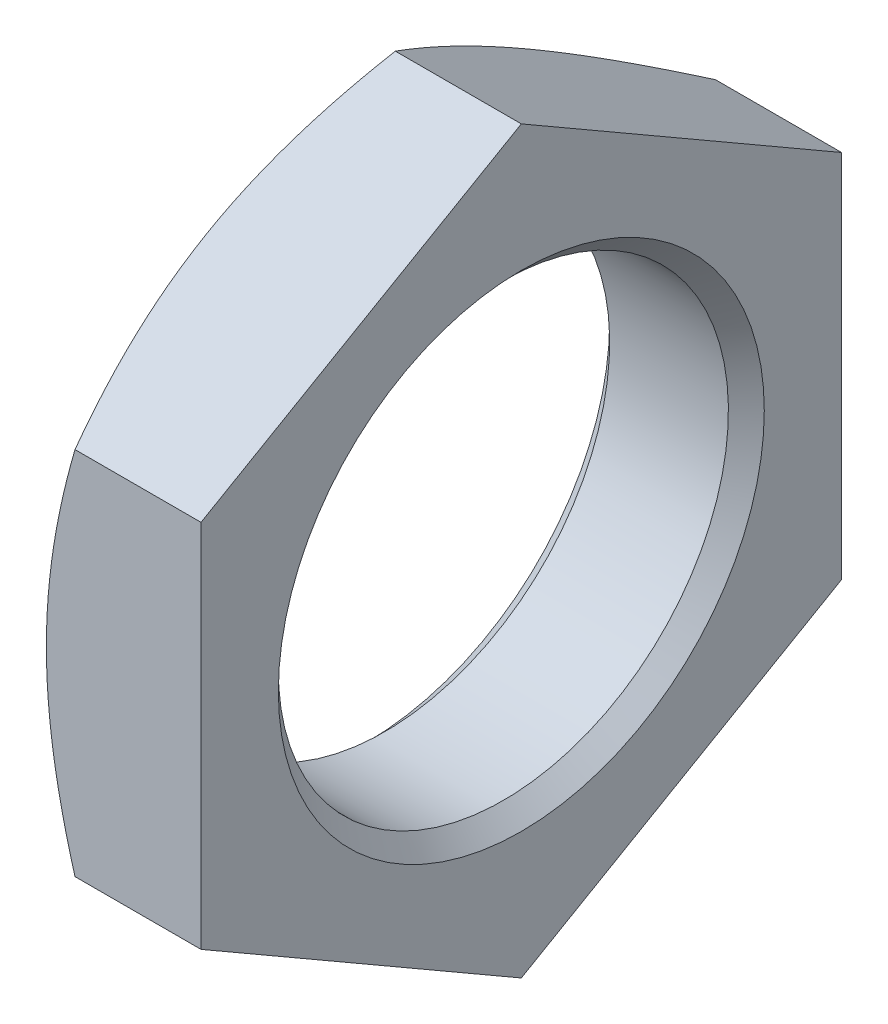
ISO-10303-21;
HEADER;
FILE_DESCRIPTION(('STEP AP214'),'2;1');
FILE_NAME('part.step','',(''),(''),'','','');
FILE_SCHEMA(('AUTOMOTIVE_DESIGN { 1 0 10303 214 1 1 1 1 }'));
ENDSEC;
DATA;
#1=APPLICATION_CONTEXT('core data for automotive mechanical design processes');
#2=APPLICATION_PROTOCOL_DEFINITION('international standard','automotive_design',2000,#1);
#3=PRODUCT_CONTEXT('',#1,'mechanical');
#4=PRODUCT('Part','Part','',(#3));
#5=PRODUCT_RELATED_PRODUCT_CATEGORY('part','',(#4));
#6=PRODUCT_DEFINITION_FORMATION('','',#4);
#7=PRODUCT_DEFINITION_CONTEXT('part definition',#1,'design');
#8=PRODUCT_DEFINITION('design','',#6,#7);
#9=PRODUCT_DEFINITION_SHAPE('','',#8);
#10=(LENGTH_UNIT() NAMED_UNIT(*) SI_UNIT(.MILLI.,.METRE.));
#11=(NAMED_UNIT(*) PLANE_ANGLE_UNIT() SI_UNIT($,.RADIAN.));
#12=(NAMED_UNIT(*) SI_UNIT($,.STERADIAN.) SOLID_ANGLE_UNIT());
#13=UNCERTAINTY_MEASURE_WITH_UNIT(LENGTH_MEASURE(1.E-05),#10,'distance_accuracy_value','');
#14=(GEOMETRIC_REPRESENTATION_CONTEXT(3) GLOBAL_UNCERTAINTY_ASSIGNED_CONTEXT((#13)) GLOBAL_UNIT_ASSIGNED_CONTEXT((#10,
#11,#12)) REPRESENTATION_CONTEXT('',''));
#15=CARTESIAN_POINT('',(0.,0.,0.));
#16=DIRECTION('',(0.,0.,1.));
#17=DIRECTION('',(1.,0.,0.));
#18=AXIS2_PLACEMENT_3D('',#15,#16,#17);
#19=CARTESIAN_POINT('',(10.,12.5573683548744,-7.25));
#20=DIRECTION('',(0.,0.866025403784439,-0.5));
#21=DIRECTION('',(0.,-0.5,-0.866025403784439));
#22=AXIS2_PLACEMENT_3D('',#19,#20,#21);
#23=PLANE('',#22);
#24=CARTESIAN_POINT('',(3.29759473000369,16.7474983125845,0.0075179770703978));
#25=CARTESIAN_POINT('',(2.,14.5017442053199,-3.88224223801837));
#26=CARTESIAN_POINT('',(2.,12.5573683548744,-7.25));
#27=CARTESIAN_POINT('',(2.,10.6129925044288,-10.6177577619816));
#28=CARTESIAN_POINT('',(3.29759473000369,8.36723839716422,-14.5075179770704));
#29=(BOUNDED_CURVE() B_SPLINE_CURVE(2,(#24,#25,#26,#27,#28),.UNSPECIFIED.,.F.,
.F.) B_SPLINE_CURVE_WITH_KNOTS((3,2,3),(0.,8.50180877639559,17.0036175527912),
.UNSPECIFIED.) CURVE() GEOMETRIC_REPRESENTATION_ITEM() RATIONAL_B_SPLINE_CURVE((1.,
1.03802697460134,1.,1.03802697460134,1.)) REPRESENTATION_ITEM(''));
#30=CARTESIAN_POINT('',(3.29508776341709,16.7431578064991,0.));
#31=VERTEX_POINT('',#30);
#32=CARTESIAN_POINT('',(2.,12.5573683548744,-7.25));
#33=VERTEX_POINT('',#32);
#34=EDGE_CURVE('E134',#31,#33,#29,.T.);
#35=ORIENTED_EDGE('',*,*,#34,.F.);
#36=DIRECTION('',(-1.,0.,0.));
#37=VECTOR('',#36,1.);
#38=CARTESIAN_POINT('',(10.,16.7431578064991,0.));
#39=LINE('',#38,#37);
#40=CARTESIAN_POINT('',(9.,16.7431578064991,0.));
#41=VERTEX_POINT('',#40);
#42=EDGE_CURVE('E11',#41,#31,#39,.T.);
#43=ORIENTED_EDGE('',*,*,#42,.F.);
#44=DIRECTION('',(0.,0.5,0.866025403784439));
#45=VECTOR('',#44,1.);
#46=CARTESIAN_POINT('',(9.,14.2915871048744,-4.24624501356141));
#47=LINE('',#46,#45);
#48=CARTESIAN_POINT('',(9.,8.37157890324957,-14.5));
#49=VERTEX_POINT('',#48);
#50=EDGE_CURVE('E105',#49,#41,#47,.T.);
#51=ORIENTED_EDGE('',*,*,#50,.F.);
#52=DIRECTION('',(-1.,0.,0.));
#53=VECTOR('',#52,1.);
#54=CARTESIAN_POINT('',(10.,8.37157890324957,-14.5));
#55=LINE('',#54,#53);
#56=CARTESIAN_POINT('',(3.29508776341709,8.37157890324957,-14.5));
#57=VERTEX_POINT('',#56);
#58=EDGE_CURVE('E31',#49,#57,#55,.T.);
#59=ORIENTED_EDGE('',*,*,#58,.T.);
#60=CARTESIAN_POINT('',(3.29759473000369,16.7474983125845,0.0075179770703978));
#61=CARTESIAN_POINT('',(2.,14.5017442053199,-3.88224223801837));
#62=CARTESIAN_POINT('',(2.,12.5573683548744,-7.25));
#63=CARTESIAN_POINT('',(2.,10.6129925044288,-10.6177577619816));
#64=CARTESIAN_POINT('',(3.29759473000369,8.36723839716422,-14.5075179770704));
#65=(BOUNDED_CURVE() B_SPLINE_CURVE(2,(#60,#61,#62,#63,#64),.UNSPECIFIED.,.F.,
.F.) B_SPLINE_CURVE_WITH_KNOTS((3,2,3),(0.,8.50180877639559,17.0036175527912),
.UNSPECIFIED.) CURVE() GEOMETRIC_REPRESENTATION_ITEM() RATIONAL_B_SPLINE_CURVE((1.,
1.03802697460134,1.,1.03802697460134,1.)) REPRESENTATION_ITEM(''));
#66=EDGE_CURVE('E203',#33,#57,#65,.T.);
#67=ORIENTED_EDGE('',*,*,#66,.F.);
#68=EDGE_LOOP('',(#35,#43,#51,#59,#67));
#69=FACE_BOUND('',#68,.T.);
#70=ADVANCED_FACE('F17',(#69),#23,.T.);
#71=CARTESIAN_POINT('',(10.,0.,14.5));
#72=DIRECTION('',(0.,0.,1.));
#73=DIRECTION('',(0.,1.,0.));
#74=AXIS2_PLACEMENT_3D('',#71,#72,#73);
#75=PLANE('',#74);
#76=CARTESIAN_POINT('',(3.29759473000369,-8.38025991542029,14.5));
#77=CARTESIAN_POINT('',(2.,-3.8887517008911,14.5));
#78=CARTESIAN_POINT('',(2.,0.,14.5));
#79=CARTESIAN_POINT('',(2.,3.88875170089109,14.5));
#80=CARTESIAN_POINT('',(3.29759473000369,8.38025991542029,14.5));
#81=(BOUNDED_CURVE() B_SPLINE_CURVE(2,(#76,#77,#78,#79,#80),.UNSPECIFIED.,.F.,
.F.) B_SPLINE_CURVE_WITH_KNOTS((3,2,3),(0.,8.50180877639559,17.0036175527912),
.UNSPECIFIED.) CURVE() GEOMETRIC_REPRESENTATION_ITEM() RATIONAL_B_SPLINE_CURVE((1.,
1.03802697460134,1.,1.03802697460134,1.)) REPRESENTATION_ITEM(''));
#82=CARTESIAN_POINT('',(3.29508776341709,-8.37157890324958,14.5));
#83=VERTEX_POINT('',#82);
#84=CARTESIAN_POINT('',(2.,0.,14.5));
#85=VERTEX_POINT('',#84);
#86=EDGE_CURVE('E175',#83,#85,#81,.T.);
#87=ORIENTED_EDGE('',*,*,#86,.F.);
#88=DIRECTION('',(-1.,0.,0.));
#89=VECTOR('',#88,1.);
#90=CARTESIAN_POINT('',(10.,-8.37157890324958,14.5));
#91=LINE('',#90,#89);
#92=CARTESIAN_POINT('',(9.,-8.37157890324958,14.5));
#93=VERTEX_POINT('',#92);
#94=EDGE_CURVE('E244',#93,#83,#91,.T.);
#95=ORIENTED_EDGE('',*,*,#94,.F.);
#96=DIRECTION('',(0.,-1.,0.));
#97=VECTOR('',#96,1.);
#98=CARTESIAN_POINT('',(9.,6.936875,14.5));
#99=LINE('',#98,#97);
#100=CARTESIAN_POINT('',(9.,8.37157890324957,14.5));
#101=VERTEX_POINT('',#100);
#102=EDGE_CURVE('E232',#101,#93,#99,.T.);
#103=ORIENTED_EDGE('',*,*,#102,.F.);
#104=DIRECTION('',(-1.,0.,0.));
#105=VECTOR('',#104,1.);
#106=CARTESIAN_POINT('',(10.,8.37157890324957,14.5));
#107=LINE('',#106,#105);
#108=CARTESIAN_POINT('',(3.29508776341709,8.37157890324957,14.5));
#109=VERTEX_POINT('',#108);
#110=EDGE_CURVE('E24',#101,#109,#107,.T.);
#111=ORIENTED_EDGE('',*,*,#110,.T.);
#112=CARTESIAN_POINT('',(3.29759473000369,-8.38025991542029,14.5));
#113=CARTESIAN_POINT('',(2.,-3.8887517008911,14.5));
#114=CARTESIAN_POINT('',(2.,0.,14.5));
#115=CARTESIAN_POINT('',(2.,3.88875170089109,14.5));
#116=CARTESIAN_POINT('',(3.29759473000369,8.38025991542029,14.5));
#117=(BOUNDED_CURVE() B_SPLINE_CURVE(2,(#112,#113,#114,#115,#116),.UNSPECIFIED.,.F.,
.F.) B_SPLINE_CURVE_WITH_KNOTS((3,2,3),(0.,8.50180877639559,17.0036175527912),
.UNSPECIFIED.) CURVE() GEOMETRIC_REPRESENTATION_ITEM() RATIONAL_B_SPLINE_CURVE((1.,
1.03802697460134,1.,1.03802697460134,1.)) REPRESENTATION_ITEM(''));
#118=EDGE_CURVE('E166',#85,#109,#117,.T.);
#119=ORIENTED_EDGE('',*,*,#118,.F.);
#120=EDGE_LOOP('',(#87,#95,#103,#111,#119));
#121=FACE_BOUND('',#120,.T.);
#122=ADVANCED_FACE('F251',(#121),#75,.T.);
#123=CARTESIAN_POINT('',(10.,12.5573683548744,7.25));
#124=DIRECTION('',(0.,0.866025403784439,0.5));
#125=DIRECTION('',(0.,0.5,-0.866025403784439));
#126=AXIS2_PLACEMENT_3D('',#123,#124,#125);
#127=PLANE('',#126);
#128=CARTESIAN_POINT('',(3.29759473000369,8.36723839716422,14.5075179770704));
#129=CARTESIAN_POINT('',(2.,10.6129925044288,10.6177577619816));
#130=CARTESIAN_POINT('',(2.,12.5573683548744,7.25));
#131=CARTESIAN_POINT('',(2.,14.5017442053199,3.88224223801838));
#132=CARTESIAN_POINT('',(3.29759473000369,16.7474983125845,-0.00751797707039494));
#133=(BOUNDED_CURVE() B_SPLINE_CURVE(2,(#128,#129,#130,#131,#132),.UNSPECIFIED.,.F.,
.F.) B_SPLINE_CURVE_WITH_KNOTS((3,2,3),(0.,8.50180877639559,17.0036175527912),
.UNSPECIFIED.) CURVE() GEOMETRIC_REPRESENTATION_ITEM() RATIONAL_B_SPLINE_CURVE((1.,
1.03802697460133,1.,1.03802697460134,1.)) REPRESENTATION_ITEM(''));
#134=CARTESIAN_POINT('',(2.,12.5573683548744,7.25));
#135=VERTEX_POINT('',#134);
#136=EDGE_CURVE('E190',#109,#135,#133,.T.);
#137=ORIENTED_EDGE('',*,*,#136,.F.);
#138=ORIENTED_EDGE('',*,*,#110,.F.);
#139=DIRECTION('',(0.,-0.5,0.866025403784439));
#140=VECTOR('',#139,1.);
#141=CARTESIAN_POINT('',(9.,14.2915871048744,4.24624501356141));
#142=LINE('',#141,#140);
#143=EDGE_CURVE('E229',#41,#101,#142,.T.);
#144=ORIENTED_EDGE('',*,*,#143,.F.);
#145=ORIENTED_EDGE('',*,*,#42,.T.);
#146=CARTESIAN_POINT('',(3.29759473000369,8.36723839716422,14.5075179770704));
#147=CARTESIAN_POINT('',(2.,10.6129925044288,10.6177577619816));
#148=CARTESIAN_POINT('',(2.,12.5573683548744,7.25));
#149=CARTESIAN_POINT('',(2.,14.5017442053199,3.88224223801838));
#150=CARTESIAN_POINT('',(3.29759473000369,16.7474983125845,-0.00751797707039494));
#151=(BOUNDED_CURVE() B_SPLINE_CURVE(2,(#146,#147,#148,#149,#150),.UNSPECIFIED.,.F.,
.F.) B_SPLINE_CURVE_WITH_KNOTS((3,2,3),(0.,8.50180877639559,17.0036175527912),
.UNSPECIFIED.) CURVE() GEOMETRIC_REPRESENTATION_ITEM() RATIONAL_B_SPLINE_CURVE((1.,
1.03802697460133,1.,1.03802697460134,1.)) REPRESENTATION_ITEM(''));
#152=EDGE_CURVE('E127',#135,#31,#151,.T.);
#153=ORIENTED_EDGE('',*,*,#152,.F.);
#154=EDGE_LOOP('',(#137,#138,#144,#145,#153));
#155=FACE_BOUND('',#154,.T.);
#156=ADVANCED_FACE('F256',(#155),#127,.T.);
#157=CARTESIAN_POINT('',(10.,0.,-14.5));
#158=DIRECTION('',(0.,0.,-1.));
#159=DIRECTION('',(0.,-1.,0.));
#160=AXIS2_PLACEMENT_3D('',#157,#158,#159);
#161=PLANE('',#160);
#162=CARTESIAN_POINT('',(3.29759473000369,8.38025991542029,-14.5));
#163=CARTESIAN_POINT('',(2.,3.88875170089109,-14.5));
#164=CARTESIAN_POINT('',(2.,0.,-14.5));
#165=CARTESIAN_POINT('',(2.,-3.88875170089109,-14.5));
#166=CARTESIAN_POINT('',(3.29759473000369,-8.38025991542029,-14.5));
#167=(BOUNDED_CURVE() B_SPLINE_CURVE(2,(#162,#163,#164,#165,#166),.UNSPECIFIED.,.F.,
.F.) B_SPLINE_CURVE_WITH_KNOTS((3,2,3),(0.,8.50180877639559,17.0036175527912),
.UNSPECIFIED.) CURVE() GEOMETRIC_REPRESENTATION_ITEM() RATIONAL_B_SPLINE_CURVE((1.,
1.03802697460135,1.,1.03802697460135,1.)) REPRESENTATION_ITEM(''));
#168=CARTESIAN_POINT('',(2.,0.,-14.5));
#169=VERTEX_POINT('',#168);
#170=CARTESIAN_POINT('',(3.29508776341709,-8.37157890324957,-14.5));
#171=VERTEX_POINT('',#170);
#172=EDGE_CURVE('E99',#169,#171,#167,.T.);
#173=ORIENTED_EDGE('',*,*,#172,.F.);
#174=CARTESIAN_POINT('',(3.29759473000369,8.38025991542029,-14.5));
#175=CARTESIAN_POINT('',(2.,3.88875170089109,-14.5));
#176=CARTESIAN_POINT('',(2.,0.,-14.5));
#177=CARTESIAN_POINT('',(2.,-3.88875170089109,-14.5));
#178=CARTESIAN_POINT('',(3.29759473000369,-8.38025991542029,-14.5));
#179=(BOUNDED_CURVE() B_SPLINE_CURVE(2,(#174,#175,#176,#177,#178),.UNSPECIFIED.,.F.,
.F.) B_SPLINE_CURVE_WITH_KNOTS((3,2,3),(0.,8.50180877639559,17.0036175527912),
.UNSPECIFIED.) CURVE() GEOMETRIC_REPRESENTATION_ITEM() RATIONAL_B_SPLINE_CURVE((1.,
1.03802697460135,1.,1.03802697460135,1.)) REPRESENTATION_ITEM(''));
#180=EDGE_CURVE('E208',#57,#169,#179,.T.);
#181=ORIENTED_EDGE('',*,*,#180,.F.);
#182=ORIENTED_EDGE('',*,*,#58,.F.);
#183=DIRECTION('',(0.,1.,0.));
#184=VECTOR('',#183,1.);
#185=CARTESIAN_POINT('',(9.,6.936875,-14.5));
#186=LINE('',#185,#184);
#187=CARTESIAN_POINT('',(9.,-8.37157890324957,-14.5));
#188=VERTEX_POINT('',#187);
#189=EDGE_CURVE('E102',#188,#49,#186,.T.);
#190=ORIENTED_EDGE('',*,*,#189,.F.);
#191=DIRECTION('',(-1.,0.,0.));
#192=VECTOR('',#191,1.);
#193=CARTESIAN_POINT('',(10.,-8.37157890324957,-14.5));
#194=LINE('',#193,#192);
#195=EDGE_CURVE('E39',#188,#171,#194,.T.);
#196=ORIENTED_EDGE('',*,*,#195,.T.);
#197=EDGE_LOOP('',(#173,#181,#182,#190,#196));
#198=FACE_BOUND('',#197,.T.);
#199=ADVANCED_FACE('F98',(#198),#161,.T.);
#200=CARTESIAN_POINT('',(10.,-12.5573683548744,7.25));
#201=DIRECTION('',(0.,-0.866025403784439,0.5));
#202=DIRECTION('',(0.,0.5,0.866025403784439));
#203=AXIS2_PLACEMENT_3D('',#200,#201,#202);
#204=PLANE('',#203);
#205=CARTESIAN_POINT('',(3.29759473000369,-16.7474983125845,-0.00751797707040161));
#206=CARTESIAN_POINT('',(2.,-14.5017442053199,3.88224223801836));
#207=CARTESIAN_POINT('',(2.,-12.5573683548744,7.25));
#208=CARTESIAN_POINT('',(2.00000000000001,-10.6129925044288,10.6177577619816));
#209=CARTESIAN_POINT('',(3.29759473000369,-8.36723839716422,14.5075179770704));
#210=(BOUNDED_CURVE() B_SPLINE_CURVE(2,(#205,#206,#207,#208,#209),.UNSPECIFIED.,.F.,
.F.) B_SPLINE_CURVE_WITH_KNOTS((3,2,3),(0.,8.50180877639559,17.0036175527912),
.UNSPECIFIED.) CURVE() GEOMETRIC_REPRESENTATION_ITEM() RATIONAL_B_SPLINE_CURVE((1.,
1.03802697460135,1.,1.03802697460134,1.)) REPRESENTATION_ITEM(''));
#211=CARTESIAN_POINT('',(2.,-12.5573683548744,7.25));
#212=VERTEX_POINT('',#211);
#213=EDGE_CURVE('E158',#212,#83,#210,.T.);
#214=ORIENTED_EDGE('',*,*,#213,.F.);
#215=CARTESIAN_POINT('',(3.29759473000369,-16.7474983125845,-0.00751797707040161));
#216=CARTESIAN_POINT('',(2.,-14.5017442053199,3.88224223801836));
#217=CARTESIAN_POINT('',(2.,-12.5573683548744,7.25));
#218=CARTESIAN_POINT('',(2.00000000000001,-10.6129925044288,10.6177577619816));
#219=CARTESIAN_POINT('',(3.29759473000369,-8.36723839716422,14.5075179770704));
#220=(BOUNDED_CURVE() B_SPLINE_CURVE(2,(#215,#216,#217,#218,#219),.UNSPECIFIED.,.F.,
.F.) B_SPLINE_CURVE_WITH_KNOTS((3,2,3),(0.,8.50180877639559,17.0036175527912),
.UNSPECIFIED.) CURVE() GEOMETRIC_REPRESENTATION_ITEM() RATIONAL_B_SPLINE_CURVE((1.,
1.03802697460135,1.,1.03802697460134,1.)) REPRESENTATION_ITEM(''));
#221=CARTESIAN_POINT('',(3.29508776341709,-16.7431578064991,0.));
#222=VERTEX_POINT('',#221);
#223=EDGE_CURVE('E113',#222,#212,#220,.T.);
#224=ORIENTED_EDGE('',*,*,#223,.F.);
#225=DIRECTION('',(-1.,0.,0.));
#226=VECTOR('',#225,1.);
#227=CARTESIAN_POINT('',(10.,-16.7431578064991,0.));
#228=LINE('',#227,#226);
#229=CARTESIAN_POINT('',(9.,-16.7431578064991,0.));
#230=VERTEX_POINT('',#229);
#231=EDGE_CURVE('E104',#230,#222,#228,.T.);
#232=ORIENTED_EDGE('',*,*,#231,.F.);
#233=DIRECTION('',(0.,-0.5,-0.866025403784439));
#234=VECTOR('',#233,1.);
#235=CARTESIAN_POINT('',(9.,-10.8231496048744,10.2537549864386));
#236=LINE('',#235,#234);
#237=EDGE_CURVE('E235',#93,#230,#236,.T.);
#238=ORIENTED_EDGE('',*,*,#237,.F.);
#239=ORIENTED_EDGE('',*,*,#94,.T.);
#240=EDGE_LOOP('',(#214,#224,#232,#238,#239));
#241=FACE_BOUND('',#240,.T.);
#242=ADVANCED_FACE('F268',(#241),#204,.T.);
#243=CARTESIAN_POINT('',(10.,-12.5573683548744,-7.25));
#244=DIRECTION('',(0.,-0.866025403784439,-0.5));
#245=DIRECTION('',(0.,-0.5,0.866025403784439));
#246=AXIS2_PLACEMENT_3D('',#243,#244,#245);
#247=PLANE('',#246);
#248=CARTESIAN_POINT('',(3.29759473000369,-8.36723839716421,-14.5075179770704));
#249=CARTESIAN_POINT('',(2.,-10.6129925044288,-10.6177577619816));
#250=CARTESIAN_POINT('',(2.,-12.5573683548744,-7.25));
#251=CARTESIAN_POINT('',(2.,-14.5017442053199,-3.88224223801838));
#252=CARTESIAN_POINT('',(3.29759473000369,-16.7474983125845,0.00751797707039685));
#253=(BOUNDED_CURVE() B_SPLINE_CURVE(2,(#248,#249,#250,#251,#252),.UNSPECIFIED.,.F.,
.F.) B_SPLINE_CURVE_WITH_KNOTS((3,2,3),(0.,8.50180877639559,17.0036175527912),
.UNSPECIFIED.) CURVE() GEOMETRIC_REPRESENTATION_ITEM() RATIONAL_B_SPLINE_CURVE((1.,
1.03802697460134,1.,1.03802697460133,1.)) REPRESENTATION_ITEM(''));
#254=CARTESIAN_POINT('',(2.,-12.5573683548744,-7.25));
#255=VERTEX_POINT('',#254);
#256=EDGE_CURVE('E117',#255,#222,#253,.T.);
#257=ORIENTED_EDGE('',*,*,#256,.F.);
#258=CARTESIAN_POINT('',(3.29759473000369,-8.36723839716421,-14.5075179770704));
#259=CARTESIAN_POINT('',(2.,-10.6129925044288,-10.6177577619816));
#260=CARTESIAN_POINT('',(2.,-12.5573683548744,-7.25));
#261=CARTESIAN_POINT('',(2.,-14.5017442053199,-3.88224223801838));
#262=CARTESIAN_POINT('',(3.29759473000369,-16.7474983125845,0.00751797707039685));
#263=(BOUNDED_CURVE() B_SPLINE_CURVE(2,(#258,#259,#260,#261,#262),.UNSPECIFIED.,.F.,
.F.) B_SPLINE_CURVE_WITH_KNOTS((3,2,3),(0.,8.50180877639559,17.0036175527912),
.UNSPECIFIED.) CURVE() GEOMETRIC_REPRESENTATION_ITEM() RATIONAL_B_SPLINE_CURVE((1.,
1.03802697460134,1.,1.03802697460133,1.)) REPRESENTATION_ITEM(''));
#264=EDGE_CURVE('E110',#171,#255,#263,.T.);
#265=ORIENTED_EDGE('',*,*,#264,.F.);
#266=ORIENTED_EDGE('',*,*,#195,.F.);
#267=DIRECTION('',(0.,0.5,-0.866025403784439));
#268=VECTOR('',#267,1.);
#269=CARTESIAN_POINT('',(9.,-10.8231496048744,-10.2537549864386));
#270=LINE('',#269,#268);
#271=EDGE_CURVE('E238',#230,#188,#270,.T.);
#272=ORIENTED_EDGE('',*,*,#271,.F.);
#273=ORIENTED_EDGE('',*,*,#231,.T.);
#274=EDGE_LOOP('',(#257,#265,#266,#272,#273));
#275=FACE_BOUND('',#274,.T.);
#276=ADVANCED_FACE('F115',(#275),#247,.T.);
#277=CARTESIAN_POINT('',(9.,13.87375,0.));
#278=DIRECTION('',(1.,0.,0.));
#279=DIRECTION('',(0.,-1.,0.));
#280=AXIS2_PLACEMENT_3D('',#277,#278,#279);
#281=PLANE('',#280);
#282=CARTESIAN_POINT('',(9.,0.,0.));
#283=DIRECTION('',(-1.,0.,0.));
#284=DIRECTION('',(0.,1.,0.));
#285=AXIS2_PLACEMENT_3D('',#282,#283,#284);
#286=CIRCLE('',#285,11.);
#287=CARTESIAN_POINT('',(9.,11.,0.));
#288=VERTEX_POINT('',#287);
#289=EDGE_CURVE('E227',#288,#288,#286,.T.);
#290=ORIENTED_EDGE('',*,*,#289,.T.);
#291=EDGE_LOOP('',(#290));
#292=FACE_BOUND('',#291,.T.);
#293=ORIENTED_EDGE('',*,*,#143,.T.);
#294=ORIENTED_EDGE('',*,*,#102,.T.);
#295=ORIENTED_EDGE('',*,*,#237,.T.);
#296=ORIENTED_EDGE('',*,*,#271,.T.);
#297=ORIENTED_EDGE('',*,*,#189,.T.);
#298=ORIENTED_EDGE('',*,*,#50,.T.);
#299=EDGE_LOOP('',(#293,#294,#295,#296,#297,#298));
#300=FACE_BOUND('',#299,.T.);
#301=ADVANCED_FACE('F271',(#292,#300),#281,.T.);
#302=CARTESIAN_POINT('',(8.5940625,0.,0.));
#303=DIRECTION('',(1.,0.,0.));
#304=DIRECTION('',(0.,1.,0.));
#305=AXIS2_PLACEMENT_3D('',#302,#303,#304);
#306=CONICAL_SURFACE('',#305,10.5940625,0.785398163397448);
#307=CARTESIAN_POINT('',(8.188125,0.,0.));
#308=DIRECTION('',(-1.,0.,0.));
#309=DIRECTION('',(0.,1.,0.));
#310=AXIS2_PLACEMENT_3D('',#307,#308,#309);
#311=CIRCLE('',#310,10.188125);
#312=CARTESIAN_POINT('',(8.188125,10.188125,0.));
#313=VERTEX_POINT('',#312);
#314=EDGE_CURVE('E225',#313,#313,#311,.T.);
#315=ORIENTED_EDGE('',*,*,#314,.T.);
#316=EDGE_LOOP('',(#315));
#317=FACE_BOUND('',#316,.T.);
#318=ORIENTED_EDGE('',*,*,#289,.F.);
#319=EDGE_LOOP('',(#318));
#320=FACE_BOUND('',#319,.T.);
#321=ADVANCED_FACE('F313',(#317,#320),#306,.F.);
#322=CARTESIAN_POINT('',(5.5,0.,0.));
#323=DIRECTION('',(1.,0.,0.));
#324=DIRECTION('',(0.,1.,0.));
#325=AXIS2_PLACEMENT_3D('',#322,#323,#324);
#326=CYLINDRICAL_SURFACE('',#325,10.188125);
#327=CARTESIAN_POINT('',(2.811875,0.,0.));
#328=DIRECTION('',(-1.,0.,0.));
#329=DIRECTION('',(0.,1.,0.));
#330=AXIS2_PLACEMENT_3D('',#327,#328,#329);
#331=CIRCLE('',#330,10.188125);
#332=CARTESIAN_POINT('',(2.811875,10.188125,0.));
#333=VERTEX_POINT('',#332);
#334=EDGE_CURVE('E223',#333,#333,#331,.T.);
#335=ORIENTED_EDGE('',*,*,#334,.T.);
#336=EDGE_LOOP('',(#335));
#337=FACE_BOUND('',#336,.T.);
#338=ORIENTED_EDGE('',*,*,#314,.F.);
#339=EDGE_LOOP('',(#338));
#340=FACE_BOUND('',#339,.T.);
#341=ADVANCED_FACE('F310',(#337,#340),#326,.F.);
#342=CARTESIAN_POINT('',(2.4059375,0.,0.));
#343=DIRECTION('',(-1.,0.,0.));
#344=DIRECTION('',(0.,1.,0.));
#345=AXIS2_PLACEMENT_3D('',#342,#343,#344);
#346=CONICAL_SURFACE('',#345,10.5940625,0.785398163397448);
#347=CARTESIAN_POINT('',(2.,0.,0.));
#348=DIRECTION('',(-1.,0.,0.));
#349=DIRECTION('',(0.,1.,0.));
#350=AXIS2_PLACEMENT_3D('',#347,#348,#349);
#351=CIRCLE('',#350,11.);
#352=CARTESIAN_POINT('',(2.,11.,0.));
#353=VERTEX_POINT('',#352);
#354=EDGE_CURVE('E221',#353,#353,#351,.T.);
#355=ORIENTED_EDGE('',*,*,#354,.T.);
#356=EDGE_LOOP('',(#355));
#357=FACE_BOUND('',#356,.T.);
#358=ORIENTED_EDGE('',*,*,#334,.F.);
#359=EDGE_LOOP('',(#358));
#360=FACE_BOUND('',#359,.T.);
#361=ADVANCED_FACE('F306',(#357,#360),#346,.F.);
#362=CARTESIAN_POINT('',(2.,12.75,0.));
#363=DIRECTION('',(-1.,0.,0.));
#364=DIRECTION('',(0.,1.,0.));
#365=AXIS2_PLACEMENT_3D('',#362,#363,#364);
#366=PLANE('',#365);
#367=CARTESIAN_POINT('',(2.,0.,0.));
#368=DIRECTION('',(-1.,0.,0.));
#369=DIRECTION('',(0.,1.,0.));
#370=AXIS2_PLACEMENT_3D('',#367,#368,#369);
#371=CIRCLE('',#370,14.5);
#372=EDGE_CURVE('E143',#135,#33,#371,.T.);
#373=ORIENTED_EDGE('',*,*,#372,.T.);
#374=CARTESIAN_POINT('',(2.,0.,0.));
#375=DIRECTION('',(-1.,0.,0.));
#376=DIRECTION('',(0.,1.,0.));
#377=AXIS2_PLACEMENT_3D('',#374,#375,#376);
#378=CIRCLE('',#377,14.5);
#379=EDGE_CURVE('E216',#33,#169,#378,.T.);
#380=ORIENTED_EDGE('',*,*,#379,.T.);
#381=CARTESIAN_POINT('',(2.,0.,0.));
#382=DIRECTION('',(-1.,0.,0.));
#383=DIRECTION('',(0.,1.,0.));
#384=AXIS2_PLACEMENT_3D('',#381,#382,#383);
#385=CIRCLE('',#384,14.5);
#386=EDGE_CURVE('E112',#169,#255,#385,.T.);
#387=ORIENTED_EDGE('',*,*,#386,.T.);
#388=CARTESIAN_POINT('',(2.,0.,0.));
#389=DIRECTION('',(-1.,0.,0.));
#390=DIRECTION('',(0.,1.,0.));
#391=AXIS2_PLACEMENT_3D('',#388,#389,#390);
#392=CIRCLE('',#391,14.5);
#393=EDGE_CURVE('E157',#255,#212,#392,.T.);
#394=ORIENTED_EDGE('',*,*,#393,.T.);
#395=CARTESIAN_POINT('',(2.,0.,0.));
#396=DIRECTION('',(-1.,0.,0.));
#397=DIRECTION('',(0.,1.,0.));
#398=AXIS2_PLACEMENT_3D('',#395,#396,#397);
#399=CIRCLE('',#398,14.5);
#400=EDGE_CURVE('E125',#212,#85,#399,.T.);
#401=ORIENTED_EDGE('',*,*,#400,.T.);
#402=CARTESIAN_POINT('',(2.,0.,0.));
#403=DIRECTION('',(-1.,0.,0.));
#404=DIRECTION('',(0.,1.,0.));
#405=AXIS2_PLACEMENT_3D('',#402,#403,#404);
#406=CIRCLE('',#405,14.5);
#407=EDGE_CURVE('E135',#85,#135,#406,.T.);
#408=ORIENTED_EDGE('',*,*,#407,.T.);
#409=EDGE_LOOP('',(#373,#380,#387,#394,#401,#408));
#410=FACE_BOUND('',#409,.T.);
#411=ORIENTED_EDGE('',*,*,#354,.F.);
#412=EDGE_LOOP('',(#411));
#413=FACE_BOUND('',#412,.T.);
#414=ADVANCED_FACE('F261',(#410,#413),#366,.T.);
#415=CARTESIAN_POINT('',(2.64879736500184,0.,0.));
#416=DIRECTION('',(1.,0.,0.));
#417=DIRECTION('',(0.,1.,0.));
#418=AXIS2_PLACEMENT_3D('',#415,#416,#417);
#419=CONICAL_SURFACE('',#418,15.62375,1.0471975511966);
#420=ORIENTED_EDGE('',*,*,#66,.T.);
#421=ORIENTED_EDGE('',*,*,#180,.T.);
#422=ORIENTED_EDGE('',*,*,#379,.F.);
#423=EDGE_LOOP('',(#420,#421,#422));
#424=FACE_BOUND('',#423,.T.);
#425=ADVANCED_FACE('F278',(#424),#419,.T.);
#426=CARTESIAN_POINT('',(2.64879736500184,0.,0.));
#427=DIRECTION('',(1.,0.,0.));
#428=DIRECTION('',(0.,1.,0.));
#429=AXIS2_PLACEMENT_3D('',#426,#427,#428);
#430=CONICAL_SURFACE('',#429,15.62375,1.0471975511966);
#431=ORIENTED_EDGE('',*,*,#152,.T.);
#432=ORIENTED_EDGE('',*,*,#34,.T.);
#433=ORIENTED_EDGE('',*,*,#372,.F.);
#434=EDGE_LOOP('',(#431,#432,#433));
#435=FACE_BOUND('',#434,.T.);
#436=ADVANCED_FACE('F276',(#435),#430,.T.);
#437=CARTESIAN_POINT('',(2.64879736500184,0.,0.));
#438=DIRECTION('',(1.,0.,0.));
#439=DIRECTION('',(0.,1.,0.));
#440=AXIS2_PLACEMENT_3D('',#437,#438,#439);
#441=CONICAL_SURFACE('',#440,15.62375,1.0471975511966);
#442=ORIENTED_EDGE('',*,*,#118,.T.);
#443=ORIENTED_EDGE('',*,*,#136,.T.);
#444=ORIENTED_EDGE('',*,*,#407,.F.);
#445=EDGE_LOOP('',(#442,#443,#444));
#446=FACE_BOUND('',#445,.T.);
#447=ADVANCED_FACE('F259',(#446),#441,.T.);
#448=CARTESIAN_POINT('',(2.64879736500184,0.,0.));
#449=DIRECTION('',(1.,0.,0.));
#450=DIRECTION('',(0.,1.,0.));
#451=AXIS2_PLACEMENT_3D('',#448,#449,#450);
#452=CONICAL_SURFACE('',#451,15.62375,1.0471975511966);
#453=ORIENTED_EDGE('',*,*,#86,.T.);
#454=ORIENTED_EDGE('',*,*,#400,.F.);
#455=ORIENTED_EDGE('',*,*,#213,.T.);
#456=EDGE_LOOP('',(#453,#454,#455));
#457=FACE_BOUND('',#456,.T.);
#458=ADVANCED_FACE('F265',(#457),#452,.T.);
#459=CARTESIAN_POINT('',(2.64879736500184,0.,0.));
#460=DIRECTION('',(1.,0.,0.));
#461=DIRECTION('',(0.,1.,0.));
#462=AXIS2_PLACEMENT_3D('',#459,#460,#461);
#463=CONICAL_SURFACE('',#462,15.62375,1.0471975511966);
#464=ORIENTED_EDGE('',*,*,#223,.T.);
#465=ORIENTED_EDGE('',*,*,#393,.F.);
#466=ORIENTED_EDGE('',*,*,#256,.T.);
#467=EDGE_LOOP('',(#464,#465,#466));
#468=FACE_BOUND('',#467,.T.);
#469=ADVANCED_FACE('F301',(#468),#463,.T.);
#470=CARTESIAN_POINT('',(2.64879736500184,0.,0.));
#471=DIRECTION('',(1.,0.,0.));
#472=DIRECTION('',(0.,1.,0.));
#473=AXIS2_PLACEMENT_3D('',#470,#471,#472);
#474=CONICAL_SURFACE('',#473,15.62375,1.0471975511966);
#475=ORIENTED_EDGE('',*,*,#264,.T.);
#476=ORIENTED_EDGE('',*,*,#386,.F.);
#477=ORIENTED_EDGE('',*,*,#172,.T.);
#478=EDGE_LOOP('',(#475,#476,#477));
#479=FACE_BOUND('',#478,.T.);
#480=ADVANCED_FACE('F109',(#479),#474,.T.);
#481=CLOSED_SHELL('',(#70,#122,#156,#199,#242,#276,#301,#321,#341,#361,#414,#425,#436,#447,#458,
#469,#480));
#482=MANIFOLD_SOLID_BREP('B1',#481);
#483=ADVANCED_BREP_SHAPE_REPRESENTATION('',(#18,#482),#14);
#484=SHAPE_DEFINITION_REPRESENTATION(#9,#483);
ENDSEC;
END-ISO-10303-21;
